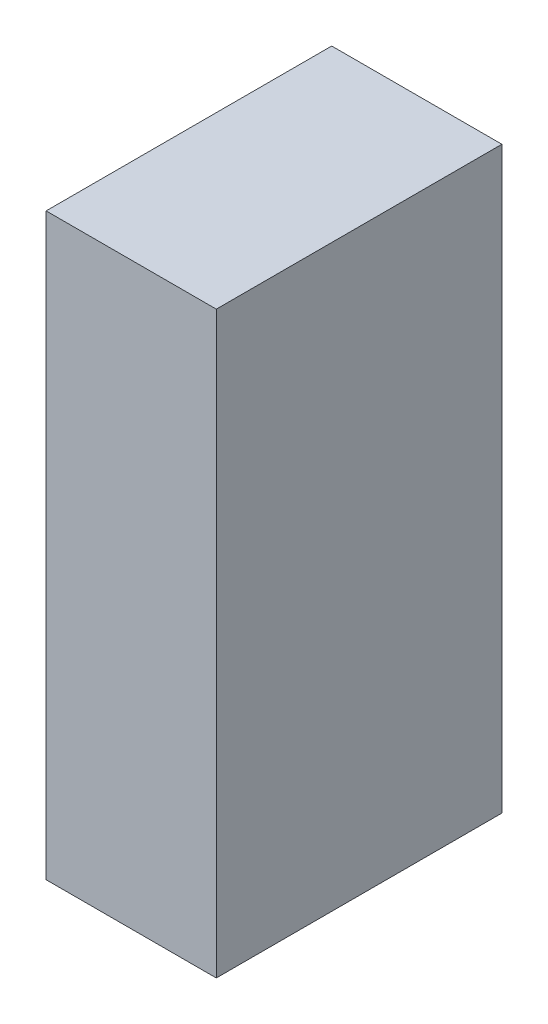
ISO-10303-21;
HEADER;
FILE_DESCRIPTION(('STEP AP214'),'2;1');
FILE_NAME('part.step','',(''),(''),'','','');
FILE_SCHEMA(('AUTOMOTIVE_DESIGN { 1 0 10303 214 1 1 1 1 }'));
ENDSEC;
DATA;
#1=APPLICATION_CONTEXT('core data for automotive mechanical design processes');
#2=APPLICATION_PROTOCOL_DEFINITION('international standard','automotive_design',2000,#1);
#3=PRODUCT_CONTEXT('',#1,'mechanical');
#4=PRODUCT('Part','Part','',(#3));
#5=PRODUCT_RELATED_PRODUCT_CATEGORY('part','',(#4));
#6=PRODUCT_DEFINITION_FORMATION('','',#4);
#7=PRODUCT_DEFINITION_CONTEXT('part definition',#1,'design');
#8=PRODUCT_DEFINITION('design','',#6,#7);
#9=PRODUCT_DEFINITION_SHAPE('','',#8);
#10=(LENGTH_UNIT() NAMED_UNIT(*) SI_UNIT(.MILLI.,.METRE.));
#11=(NAMED_UNIT(*) PLANE_ANGLE_UNIT() SI_UNIT($,.RADIAN.));
#12=(NAMED_UNIT(*) SI_UNIT($,.STERADIAN.) SOLID_ANGLE_UNIT());
#13=UNCERTAINTY_MEASURE_WITH_UNIT(LENGTH_MEASURE(1.E-05),#10,'distance_accuracy_value','');
#14=(GEOMETRIC_REPRESENTATION_CONTEXT(3) GLOBAL_UNCERTAINTY_ASSIGNED_CONTEXT((#13)) GLOBAL_UNIT_ASSIGNED_CONTEXT((#10,
#11,#12)) REPRESENTATION_CONTEXT('',''));
#15=CARTESIAN_POINT('',(0.,0.,0.));
#16=DIRECTION('',(0.,0.,1.));
#17=DIRECTION('',(1.,0.,0.));
#18=AXIS2_PLACEMENT_3D('',#15,#16,#17);
#19=CARTESIAN_POINT('',(2.83020262,-9.63349864,9.49899802));
#20=DIRECTION('',(0.,0.,1.));
#21=DIRECTION('',(1.,0.,0.));
#22=AXIS2_PLACEMENT_3D('',#19,#20,#21);
#23=PLANE('',#22);
#24=DIRECTION('',(0.,-1.,0.));
#25=VECTOR('',#24,1.);
#26=CARTESIAN_POINT('',(2.83020262,9.63350118,9.49899802));
#27=LINE('',#26,#25);
#28=CARTESIAN_POINT('',(2.83020262,9.63350118,9.49899802));
#29=VERTEX_POINT('',#28);
#30=CARTESIAN_POINT('',(2.83020262,-9.63349864,9.49899802));
#31=VERTEX_POINT('',#30);
#32=EDGE_CURVE('E26',#29,#31,#27,.T.);
#33=ORIENTED_EDGE('',*,*,#32,.F.);
#34=DIRECTION('',(1.,0.,0.));
#35=VECTOR('',#34,1.);
#36=CARTESIAN_POINT('',(-2.83020008,9.63350118,9.49899802));
#37=LINE('',#36,#35);
#38=CARTESIAN_POINT('',(-2.83020008,9.63350118,9.49899802));
#39=VERTEX_POINT('',#38);
#40=EDGE_CURVE('E68',#39,#29,#37,.T.);
#41=ORIENTED_EDGE('',*,*,#40,.F.);
#42=DIRECTION('',(0.,1.,0.));
#43=VECTOR('',#42,1.);
#44=CARTESIAN_POINT('',(-2.83020008,-9.63349864,9.49899802));
#45=LINE('',#44,#43);
#46=CARTESIAN_POINT('',(-2.83020008,-9.63349864,9.49899802));
#47=VERTEX_POINT('',#46);
#48=EDGE_CURVE('E71',#47,#39,#45,.T.);
#49=ORIENTED_EDGE('',*,*,#48,.F.);
#50=DIRECTION('',(-1.,0.,0.));
#51=VECTOR('',#50,1.);
#52=CARTESIAN_POINT('',(2.83020262,-9.63349864,9.49899802));
#53=LINE('',#52,#51);
#54=EDGE_CURVE('E101',#31,#47,#53,.T.);
#55=ORIENTED_EDGE('',*,*,#54,.F.);
#56=EDGE_LOOP('',(#33,#41,#49,#55));
#57=FACE_BOUND('',#56,.T.);
#58=ADVANCED_FACE('F16',(#57),#23,.T.);
#59=CARTESIAN_POINT('',(2.83020262,-9.63349864,0.));
#60=DIRECTION('',(0.,0.,1.));
#61=DIRECTION('',(1.,0.,0.));
#62=AXIS2_PLACEMENT_3D('',#59,#60,#61);
#63=PLANE('',#62);
#64=DIRECTION('',(-1.,0.,0.));
#65=VECTOR('',#64,1.);
#66=CARTESIAN_POINT('',(2.83020262,-9.63349864,0.));
#67=LINE('',#66,#65);
#68=CARTESIAN_POINT('',(2.83020262,-9.63349864,0.));
#69=VERTEX_POINT('',#68);
#70=CARTESIAN_POINT('',(-2.83020008,-9.63349864,0.));
#71=VERTEX_POINT('',#70);
#72=EDGE_CURVE('E91',#69,#71,#67,.T.);
#73=ORIENTED_EDGE('',*,*,#72,.T.);
#74=DIRECTION('',(0.,1.,0.));
#75=VECTOR('',#74,1.);
#76=CARTESIAN_POINT('',(-2.83020008,-9.63349864,0.));
#77=LINE('',#76,#75);
#78=CARTESIAN_POINT('',(-2.83020008,9.63350118,0.));
#79=VERTEX_POINT('',#78);
#80=EDGE_CURVE('E77',#71,#79,#77,.T.);
#81=ORIENTED_EDGE('',*,*,#80,.T.);
#82=DIRECTION('',(1.,0.,0.));
#83=VECTOR('',#82,1.);
#84=CARTESIAN_POINT('',(-2.83020008,9.63350118,0.));
#85=LINE('',#84,#83);
#86=CARTESIAN_POINT('',(2.83020262,9.63350118,0.));
#87=VERTEX_POINT('',#86);
#88=EDGE_CURVE('E20',#79,#87,#85,.T.);
#89=ORIENTED_EDGE('',*,*,#88,.T.);
#90=DIRECTION('',(0.,-1.,0.));
#91=VECTOR('',#90,1.);
#92=CARTESIAN_POINT('',(2.83020262,9.63350118,0.));
#93=LINE('',#92,#91);
#94=EDGE_CURVE('E11',#87,#69,#93,.T.);
#95=ORIENTED_EDGE('',*,*,#94,.T.);
#96=EDGE_LOOP('',(#73,#81,#89,#95));
#97=FACE_BOUND('',#96,.T.);
#98=ADVANCED_FACE('F119',(#97),#63,.F.);
#99=CARTESIAN_POINT('',(2.83020262,9.63350118,0.));
#100=DIRECTION('',(1.,0.,0.));
#101=DIRECTION('',(0.,1.,0.));
#102=AXIS2_PLACEMENT_3D('',#99,#100,#101);
#103=PLANE('',#102);
#104=DIRECTION('',(0.,0.,1.));
#105=VECTOR('',#104,1.);
#106=CARTESIAN_POINT('',(2.83020262,9.63350118,0.));
#107=LINE('',#106,#105);
#108=EDGE_CURVE('E76',#87,#29,#107,.T.);
#109=ORIENTED_EDGE('',*,*,#108,.T.);
#110=ORIENTED_EDGE('',*,*,#32,.T.);
#111=DIRECTION('',(0.,0.,1.));
#112=VECTOR('',#111,1.);
#113=CARTESIAN_POINT('',(2.83020262,-9.63349864,0.));
#114=LINE('',#113,#112);
#115=EDGE_CURVE('E104',#69,#31,#114,.T.);
#116=ORIENTED_EDGE('',*,*,#115,.F.);
#117=ORIENTED_EDGE('',*,*,#94,.F.);
#118=EDGE_LOOP('',(#109,#110,#116,#117));
#119=FACE_BOUND('',#118,.T.);
#120=ADVANCED_FACE('F18',(#119),#103,.T.);
#121=CARTESIAN_POINT('',(-2.83020008,9.63350118,0.));
#122=DIRECTION('',(0.,1.,0.));
#123=DIRECTION('',(1.,0.,0.));
#124=AXIS2_PLACEMENT_3D('',#121,#122,#123);
#125=PLANE('',#124);
#126=DIRECTION('',(0.,0.,1.));
#127=VECTOR('',#126,1.);
#128=CARTESIAN_POINT('',(-2.83020008,9.63350118,0.));
#129=LINE('',#128,#127);
#130=EDGE_CURVE('E80',#79,#39,#129,.T.);
#131=ORIENTED_EDGE('',*,*,#130,.T.);
#132=ORIENTED_EDGE('',*,*,#40,.T.);
#133=ORIENTED_EDGE('',*,*,#108,.F.);
#134=ORIENTED_EDGE('',*,*,#88,.F.);
#135=EDGE_LOOP('',(#131,#132,#133,#134));
#136=FACE_BOUND('',#135,.T.);
#137=ADVANCED_FACE('F81',(#136),#125,.T.);
#138=CARTESIAN_POINT('',(-2.83020008,-9.63349864,0.));
#139=DIRECTION('',(-1.,0.,0.));
#140=DIRECTION('',(0.,0.,1.));
#141=AXIS2_PLACEMENT_3D('',#138,#139,#140);
#142=PLANE('',#141);
#143=DIRECTION('',(0.,0.,1.));
#144=VECTOR('',#143,1.);
#145=CARTESIAN_POINT('',(-2.83020008,-9.63349864,0.));
#146=LINE('',#145,#144);
#147=EDGE_CURVE('E88',#71,#47,#146,.T.);
#148=ORIENTED_EDGE('',*,*,#147,.T.);
#149=ORIENTED_EDGE('',*,*,#48,.T.);
#150=ORIENTED_EDGE('',*,*,#130,.F.);
#151=ORIENTED_EDGE('',*,*,#80,.F.);
#152=EDGE_LOOP('',(#148,#149,#150,#151));
#153=FACE_BOUND('',#152,.T.);
#154=ADVANCED_FACE('F86',(#153),#142,.T.);
#155=CARTESIAN_POINT('',(2.83020262,-9.63349864,0.));
#156=DIRECTION('',(0.,-1.,0.));
#157=DIRECTION('',(0.,0.,-1.));
#158=AXIS2_PLACEMENT_3D('',#155,#156,#157);
#159=PLANE('',#158);
#160=ORIENTED_EDGE('',*,*,#115,.T.);
#161=ORIENTED_EDGE('',*,*,#54,.T.);
#162=ORIENTED_EDGE('',*,*,#147,.F.);
#163=ORIENTED_EDGE('',*,*,#72,.F.);
#164=EDGE_LOOP('',(#160,#161,#162,#163));
#165=FACE_BOUND('',#164,.T.);
#166=ADVANCED_FACE('F135',(#165),#159,.T.);
#167=CLOSED_SHELL('',(#58,#98,#120,#137,#154,#166));
#168=MANIFOLD_SOLID_BREP('B1',#167);
#169=ADVANCED_BREP_SHAPE_REPRESENTATION('',(#18,#168),#14);
#170=SHAPE_DEFINITION_REPRESENTATION(#9,#169);
ENDSEC;
END-ISO-10303-21;
